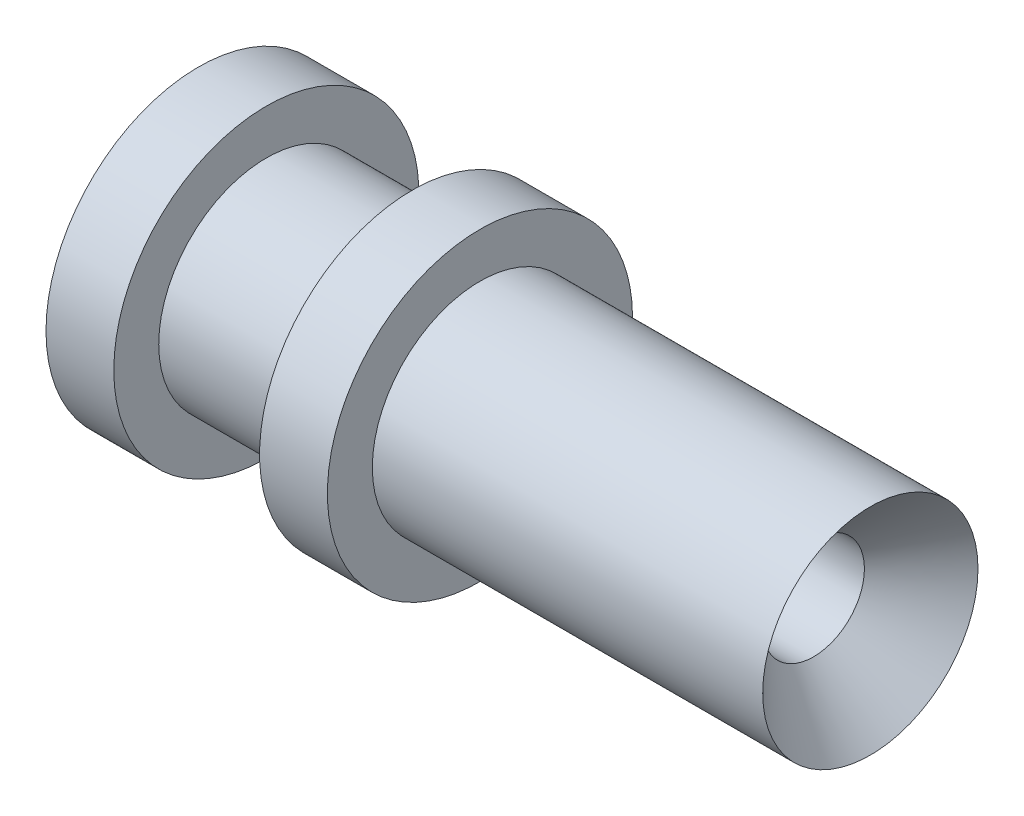
ISO-10303-21;
HEADER;
FILE_DESCRIPTION(('STEP AP214'),'2;1');
FILE_NAME('part.step','',(''),(''),'','','');
FILE_SCHEMA(('AUTOMOTIVE_DESIGN { 1 0 10303 214 1 1 1 1 }'));
ENDSEC;
DATA;
#1=APPLICATION_CONTEXT('core data for automotive mechanical design processes');
#2=APPLICATION_PROTOCOL_DEFINITION('international standard','automotive_design',2000,#1);
#3=PRODUCT_CONTEXT('',#1,'mechanical');
#4=PRODUCT('Part','Part','',(#3));
#5=PRODUCT_RELATED_PRODUCT_CATEGORY('part','',(#4));
#6=PRODUCT_DEFINITION_FORMATION('','',#4);
#7=PRODUCT_DEFINITION_CONTEXT('part definition',#1,'design');
#8=PRODUCT_DEFINITION('design','',#6,#7);
#9=PRODUCT_DEFINITION_SHAPE('','',#8);
#10=(LENGTH_UNIT() NAMED_UNIT(*) SI_UNIT(.MILLI.,.METRE.));
#11=(NAMED_UNIT(*) PLANE_ANGLE_UNIT() SI_UNIT($,.RADIAN.));
#12=(NAMED_UNIT(*) SI_UNIT($,.STERADIAN.) SOLID_ANGLE_UNIT());
#13=UNCERTAINTY_MEASURE_WITH_UNIT(LENGTH_MEASURE(1.E-05),#10,'distance_accuracy_value','');
#14=(GEOMETRIC_REPRESENTATION_CONTEXT(3) GLOBAL_UNCERTAINTY_ASSIGNED_CONTEXT((#13)) GLOBAL_UNIT_ASSIGNED_CONTEXT((#10,
#11,#12)) REPRESENTATION_CONTEXT('',''));
#15=CARTESIAN_POINT('',(0.,0.,0.));
#16=DIRECTION('',(0.,0.,1.));
#17=DIRECTION('',(1.,0.,0.));
#18=AXIS2_PLACEMENT_3D('',#15,#16,#17);
#19=CARTESIAN_POINT('',(-2.,0.,0.));
#20=DIRECTION('',(-1.,0.,0.));
#21=DIRECTION('',(0.,0.,1.));
#22=AXIS2_PLACEMENT_3D('',#19,#20,#21);
#23=PLANE('',#22);
#24=CARTESIAN_POINT('',(-2.,0.,0.));
#25=DIRECTION('',(-1.,0.,0.));
#26=DIRECTION('',(0.,0.,1.));
#27=AXIS2_PLACEMENT_3D('',#24,#25,#26);
#28=CIRCLE('',#27,4.5);
#29=CARTESIAN_POINT('',(-2.,0.,4.5));
#30=VERTEX_POINT('',#29);
#31=EDGE_CURVE('E143',#30,#30,#28,.T.);
#32=ORIENTED_EDGE('',*,*,#31,.T.);
#33=EDGE_LOOP('',(#32));
#34=FACE_BOUND('',#33,.T.);
#35=DIRECTION('',(0.,-1.,0.));
#36=VECTOR('',#35,1.);
#37=CARTESIAN_POINT('',(-2.,0.,2.8));
#38=LINE('',#37,#36);
#39=CARTESIAN_POINT('',(-2.,1.61658075373095,2.8));
#40=VERTEX_POINT('',#39);
#41=CARTESIAN_POINT('',(-2.,-1.61658075373095,2.8));
#42=VERTEX_POINT('',#41);
#43=EDGE_CURVE('E50',#40,#42,#38,.T.);
#44=ORIENTED_EDGE('',*,*,#43,.T.);
#45=DIRECTION('',(0.,-0.5,-0.866025403784439));
#46=VECTOR('',#45,1.);
#47=CARTESIAN_POINT('',(-2.,-2.42487113059643,1.4));
#48=LINE('',#47,#46);
#49=CARTESIAN_POINT('',(-2.,-3.2331615074619,0.));
#50=VERTEX_POINT('',#49);
#51=EDGE_CURVE('E11',#42,#50,#48,.T.);
#52=ORIENTED_EDGE('',*,*,#51,.T.);
#53=DIRECTION('',(0.,0.5,-0.866025403784439));
#54=VECTOR('',#53,1.);
#55=CARTESIAN_POINT('',(-2.,-2.42487113059643,-1.4));
#56=LINE('',#55,#54);
#57=CARTESIAN_POINT('',(-2.,-1.61658075373095,-2.8));
#58=VERTEX_POINT('',#57);
#59=EDGE_CURVE('E155',#50,#58,#56,.T.);
#60=ORIENTED_EDGE('',*,*,#59,.T.);
#61=DIRECTION('',(0.,1.,0.));
#62=VECTOR('',#61,1.);
#63=CARTESIAN_POINT('',(-2.,0.,-2.8));
#64=LINE('',#63,#62);
#65=CARTESIAN_POINT('',(-2.,1.61658075373095,-2.8));
#66=VERTEX_POINT('',#65);
#67=EDGE_CURVE('E162',#58,#66,#64,.T.);
#68=ORIENTED_EDGE('',*,*,#67,.T.);
#69=DIRECTION('',(0.,0.5,0.866025403784439));
#70=VECTOR('',#69,1.);
#71=CARTESIAN_POINT('',(-2.,2.42487113059643,-1.4));
#72=LINE('',#71,#70);
#73=CARTESIAN_POINT('',(-2.,3.2331615074619,0.));
#74=VERTEX_POINT('',#73);
#75=EDGE_CURVE('E165',#66,#74,#72,.T.);
#76=ORIENTED_EDGE('',*,*,#75,.T.);
#77=DIRECTION('',(0.,-0.5,0.866025403784439));
#78=VECTOR('',#77,1.);
#79=CARTESIAN_POINT('',(-2.,2.42487113059643,1.4));
#80=LINE('',#79,#78);
#81=EDGE_CURVE('E168',#74,#40,#80,.T.);
#82=ORIENTED_EDGE('',*,*,#81,.T.);
#83=EDGE_LOOP('',(#44,#52,#60,#68,#76,#82));
#84=FACE_BOUND('',#83,.T.);
#85=ADVANCED_FACE('F41',(#34,#84),#23,.T.);
#86=CARTESIAN_POINT('',(18.,0.,0.));
#87=DIRECTION('',(-1.,0.,0.));
#88=DIRECTION('',(0.,0.,1.));
#89=AXIS2_PLACEMENT_3D('',#86,#87,#88);
#90=CYLINDRICAL_SURFACE('',#89,1.5);
#91=CARTESIAN_POINT('',(-1.,0.,0.));
#92=DIRECTION('',(-1.,0.,0.));
#93=DIRECTION('',(0.,0.,1.));
#94=AXIS2_PLACEMENT_3D('',#91,#92,#93);
#95=CIRCLE('',#94,1.5);
#96=CARTESIAN_POINT('',(-1.,0.,1.5));
#97=VERTEX_POINT('',#96);
#98=EDGE_CURVE('E100',#97,#97,#95,.F.);
#99=ORIENTED_EDGE('',*,*,#98,.F.);
#100=EDGE_LOOP('',(#99));
#101=FACE_BOUND('',#100,.T.);
#102=CARTESIAN_POINT('',(16.14,0.,0.));
#103=DIRECTION('',(1.,0.,0.));
#104=DIRECTION('',(0.,0.,-1.));
#105=AXIS2_PLACEMENT_3D('',#102,#103,#104);
#106=CIRCLE('',#105,1.5);
#107=CARTESIAN_POINT('',(16.14,0.,-1.5));
#108=VERTEX_POINT('',#107);
#109=EDGE_CURVE('E118',#108,#108,#106,.T.);
#110=ORIENTED_EDGE('',*,*,#109,.T.);
#111=EDGE_LOOP('',(#110));
#112=FACE_BOUND('',#111,.T.);
#113=ADVANCED_FACE('F196',(#101,#112),#90,.F.);
#114=CARTESIAN_POINT('',(18.,0.,0.));
#115=DIRECTION('',(-1.,0.,0.));
#116=DIRECTION('',(0.,0.,1.));
#117=AXIS2_PLACEMENT_3D('',#114,#115,#116);
#118=CYLINDRICAL_SURFACE('',#117,3.175);
#119=CARTESIAN_POINT('',(0.,0.,0.));
#120=DIRECTION('',(1.,0.,0.));
#121=DIRECTION('',(0.,0.,-1.));
#122=AXIS2_PLACEMENT_3D('',#119,#120,#121);
#123=CIRCLE('',#122,3.175);
#124=CARTESIAN_POINT('',(0.,0.,-3.175));
#125=VERTEX_POINT('',#124);
#126=EDGE_CURVE('E146',#125,#125,#123,.T.);
#127=ORIENTED_EDGE('',*,*,#126,.T.);
#128=EDGE_LOOP('',(#127));
#129=FACE_BOUND('',#128,.T.);
#130=CARTESIAN_POINT('',(4.30000000000008,0.,0.));
#131=DIRECTION('',(1.,0.,0.));
#132=DIRECTION('',(0.,0.,-1.));
#133=AXIS2_PLACEMENT_3D('',#130,#131,#132);
#134=CIRCLE('',#133,3.175);
#135=CARTESIAN_POINT('',(4.30000000000008,0.,-3.175));
#136=VERTEX_POINT('',#135);
#137=EDGE_CURVE('E152',#136,#136,#134,.T.);
#138=ORIENTED_EDGE('',*,*,#137,.F.);
#139=EDGE_LOOP('',(#138));
#140=FACE_BOUND('',#139,.T.);
#141=ADVANCED_FACE('F203',(#129,#140),#118,.T.);
#142=CARTESIAN_POINT('',(-2.,0.,0.));
#143=DIRECTION('',(1.,0.,0.));
#144=DIRECTION('',(0.,0.,-1.));
#145=AXIS2_PLACEMENT_3D('',#142,#143,#144);
#146=CYLINDRICAL_SURFACE('',#145,4.5);
#147=ORIENTED_EDGE('',*,*,#31,.F.);
#148=EDGE_LOOP('',(#147));
#149=FACE_BOUND('',#148,.T.);
#150=CARTESIAN_POINT('',(0.,0.,0.));
#151=DIRECTION('',(-1.,0.,0.));
#152=DIRECTION('',(0.,0.,1.));
#153=AXIS2_PLACEMENT_3D('',#150,#151,#152);
#154=CIRCLE('',#153,4.5);
#155=CARTESIAN_POINT('',(0.,0.,4.5));
#156=VERTEX_POINT('',#155);
#157=EDGE_CURVE('E147',#156,#156,#154,.T.);
#158=ORIENTED_EDGE('',*,*,#157,.T.);
#159=EDGE_LOOP('',(#158));
#160=FACE_BOUND('',#159,.T.);
#161=ADVANCED_FACE('F212',(#149,#160),#146,.T.);
#162=CARTESIAN_POINT('',(0.,0.,0.));
#163=DIRECTION('',(-1.,0.,0.));
#164=DIRECTION('',(0.,0.,1.));
#165=AXIS2_PLACEMENT_3D('',#162,#163,#164);
#166=PLANE('',#165);
#167=ORIENTED_EDGE('',*,*,#126,.F.);
#168=EDGE_LOOP('',(#167));
#169=FACE_BOUND('',#168,.T.);
#170=ORIENTED_EDGE('',*,*,#157,.F.);
#171=EDGE_LOOP('',(#170));
#172=FACE_BOUND('',#171,.T.);
#173=ADVANCED_FACE('F210',(#169,#172),#166,.F.);
#174=CARTESIAN_POINT('',(6.30000000000008,0.,0.));
#175=DIRECTION('',(-1.,0.,0.));
#176=DIRECTION('',(0.,0.,1.));
#177=AXIS2_PLACEMENT_3D('',#174,#175,#176);
#178=CYLINDRICAL_SURFACE('',#177,4.5);
#179=CARTESIAN_POINT('',(6.30000000000008,0.,0.));
#180=DIRECTION('',(1.,0.,0.));
#181=DIRECTION('',(0.,0.,-1.));
#182=AXIS2_PLACEMENT_3D('',#179,#180,#181);
#183=CIRCLE('',#182,4.5);
#184=CARTESIAN_POINT('',(6.30000000000008,0.,-4.5));
#185=VERTEX_POINT('',#184);
#186=EDGE_CURVE('E136',#185,#185,#183,.T.);
#187=ORIENTED_EDGE('',*,*,#186,.F.);
#188=EDGE_LOOP('',(#187));
#189=FACE_BOUND('',#188,.T.);
#190=CARTESIAN_POINT('',(4.30000000000008,0.,0.));
#191=DIRECTION('',(1.,0.,0.));
#192=DIRECTION('',(0.,0.,-1.));
#193=AXIS2_PLACEMENT_3D('',#190,#191,#192);
#194=CIRCLE('',#193,4.5);
#195=CARTESIAN_POINT('',(4.30000000000008,0.,-4.5));
#196=VERTEX_POINT('',#195);
#197=EDGE_CURVE('E140',#196,#196,#194,.T.);
#198=ORIENTED_EDGE('',*,*,#197,.T.);
#199=EDGE_LOOP('',(#198));
#200=FACE_BOUND('',#199,.T.);
#201=ADVANCED_FACE('F208',(#189,#200),#178,.T.);
#202=CARTESIAN_POINT('',(6.30000000000008,0.,0.));
#203=DIRECTION('',(1.,0.,0.));
#204=DIRECTION('',(0.,0.,-1.));
#205=AXIS2_PLACEMENT_3D('',#202,#203,#204);
#206=PLANE('',#205);
#207=CARTESIAN_POINT('',(6.30000000000008,0.,0.));
#208=DIRECTION('',(1.,0.,0.));
#209=DIRECTION('',(0.,0.,-1.));
#210=AXIS2_PLACEMENT_3D('',#207,#208,#209);
#211=CIRCLE('',#210,3.175);
#212=CARTESIAN_POINT('',(6.30000000000008,0.,-3.175));
#213=VERTEX_POINT('',#212);
#214=EDGE_CURVE('E139',#213,#213,#211,.T.);
#215=ORIENTED_EDGE('',*,*,#214,.F.);
#216=EDGE_LOOP('',(#215));
#217=FACE_BOUND('',#216,.T.);
#218=ORIENTED_EDGE('',*,*,#186,.T.);
#219=EDGE_LOOP('',(#218));
#220=FACE_BOUND('',#219,.T.);
#221=ADVANCED_FACE('F233',(#217,#220),#206,.T.);
#222=CARTESIAN_POINT('',(4.30000000000008,0.,0.));
#223=DIRECTION('',(1.,0.,0.));
#224=DIRECTION('',(0.,0.,-1.));
#225=AXIS2_PLACEMENT_3D('',#222,#223,#224);
#226=PLANE('',#225);
#227=ORIENTED_EDGE('',*,*,#137,.T.);
#228=EDGE_LOOP('',(#227));
#229=FACE_BOUND('',#228,.T.);
#230=ORIENTED_EDGE('',*,*,#197,.F.);
#231=EDGE_LOOP('',(#230));
#232=FACE_BOUND('',#231,.T.);
#233=ADVANCED_FACE('F229',(#229,#232),#226,.F.);
#234=CARTESIAN_POINT('',(17.815,0.,0.));
#235=DIRECTION('',(1.,0.,0.));
#236=DIRECTION('',(0.,0.,-1.));
#237=AXIS2_PLACEMENT_3D('',#234,#235,#236);
#238=CIRCLE('',#237,3.175);
#239=CARTESIAN_POINT('',(17.815,0.,-3.175));
#240=VERTEX_POINT('',#239);
#241=EDGE_CURVE('E45',#240,#240,#238,.F.);
#242=ORIENTED_EDGE('',*,*,#241,.T.);
#243=EDGE_LOOP('',(#242));
#244=FACE_BOUND('',#243,.T.);
#245=ORIENTED_EDGE('',*,*,#214,.T.);
#246=EDGE_LOOP('',(#245));
#247=FACE_BOUND('',#246,.T.);
#248=ADVANCED_FACE('F43',(#244,#247),#118,.T.);
#249=CARTESIAN_POINT('',(-1.,0.,0.));
#250=DIRECTION('',(-1.,0.,0.));
#251=DIRECTION('',(0.,0.,1.));
#252=AXIS2_PLACEMENT_3D('',#249,#250,#251);
#253=PLANE('',#252);
#254=DIRECTION('',(0.,0.5,0.866025403784439));
#255=VECTOR('',#254,1.);
#256=CARTESIAN_POINT('',(-1.,-3.2331615074619,0.));
#257=LINE('',#256,#255);
#258=CARTESIAN_POINT('',(-1.,-3.2331615074619,0.));
#259=VERTEX_POINT('',#258);
#260=CARTESIAN_POINT('',(-1.,-1.61658075373095,2.8));
#261=VERTEX_POINT('',#260);
#262=EDGE_CURVE('E96',#259,#261,#257,.T.);
#263=ORIENTED_EDGE('',*,*,#262,.T.);
#264=DIRECTION('',(0.,1.,0.));
#265=VECTOR('',#264,1.);
#266=CARTESIAN_POINT('',(-1.,-1.61658075373095,2.8));
#267=LINE('',#266,#265);
#268=CARTESIAN_POINT('',(-1.,1.61658075373095,2.8));
#269=VERTEX_POINT('',#268);
#270=EDGE_CURVE('E104',#261,#269,#267,.T.);
#271=ORIENTED_EDGE('',*,*,#270,.T.);
#272=DIRECTION('',(0.,0.5,-0.866025403784439));
#273=VECTOR('',#272,1.);
#274=CARTESIAN_POINT('',(-1.,1.61658075373095,2.8));
#275=LINE('',#274,#273);
#276=CARTESIAN_POINT('',(-1.,3.2331615074619,0.));
#277=VERTEX_POINT('',#276);
#278=EDGE_CURVE('E110',#269,#277,#275,.T.);
#279=ORIENTED_EDGE('',*,*,#278,.T.);
#280=DIRECTION('',(0.,-0.5,-0.866025403784439));
#281=VECTOR('',#280,1.);
#282=CARTESIAN_POINT('',(-1.,3.2331615074619,0.));
#283=LINE('',#282,#281);
#284=CARTESIAN_POINT('',(-1.,1.61658075373095,-2.8));
#285=VERTEX_POINT('',#284);
#286=EDGE_CURVE('E122',#277,#285,#283,.T.);
#287=ORIENTED_EDGE('',*,*,#286,.T.);
#288=DIRECTION('',(0.,-1.,0.));
#289=VECTOR('',#288,1.);
#290=CARTESIAN_POINT('',(-1.,1.61658075373095,-2.8));
#291=LINE('',#290,#289);
#292=CARTESIAN_POINT('',(-1.,-1.61658075373095,-2.8));
#293=VERTEX_POINT('',#292);
#294=EDGE_CURVE('E125',#285,#293,#291,.T.);
#295=ORIENTED_EDGE('',*,*,#294,.T.);
#296=DIRECTION('',(0.,-0.5,0.866025403784439));
#297=VECTOR('',#296,1.);
#298=CARTESIAN_POINT('',(-1.,-1.61658075373095,-2.8));
#299=LINE('',#298,#297);
#300=EDGE_CURVE('E115',#293,#259,#299,.T.);
#301=ORIENTED_EDGE('',*,*,#300,.T.);
#302=EDGE_LOOP('',(#263,#271,#279,#287,#295,#301));
#303=FACE_BOUND('',#302,.T.);
#304=ORIENTED_EDGE('',*,*,#98,.T.);
#305=EDGE_LOOP('',(#304));
#306=FACE_BOUND('',#305,.T.);
#307=ADVANCED_FACE('F112',(#303,#306),#253,.T.);
#308=CARTESIAN_POINT('',(-2.000012,-3.2331615074619,0.));
#309=DIRECTION('',(0.,0.866025403784439,-0.5));
#310=DIRECTION('',(0.,0.5,0.866025403784439));
#311=AXIS2_PLACEMENT_3D('',#308,#309,#310);
#312=PLANE('',#311);
#313=DIRECTION('',(1.,0.,0.));
#314=VECTOR('',#313,1.);
#315=CARTESIAN_POINT('',(-2.000012,-1.61658075373095,2.8));
#316=LINE('',#315,#314);
#317=EDGE_CURVE('E92',#42,#261,#316,.T.);
#318=ORIENTED_EDGE('',*,*,#317,.T.);
#319=ORIENTED_EDGE('',*,*,#262,.F.);
#320=DIRECTION('',(1.,0.,0.));
#321=VECTOR('',#320,1.);
#322=CARTESIAN_POINT('',(-2.000012,-3.2331615074619,0.));
#323=LINE('',#322,#321);
#324=EDGE_CURVE('E128',#50,#259,#323,.T.);
#325=ORIENTED_EDGE('',*,*,#324,.F.);
#326=ORIENTED_EDGE('',*,*,#51,.F.);
#327=EDGE_LOOP('',(#318,#319,#325,#326));
#328=FACE_BOUND('',#327,.T.);
#329=ADVANCED_FACE('F94',(#328),#312,.T.);
#330=CARTESIAN_POINT('',(-2.000012,-1.61658075373095,2.8));
#331=DIRECTION('',(0.,0.,-1.));
#332=DIRECTION('',(-1.,0.,0.));
#333=AXIS2_PLACEMENT_3D('',#330,#331,#332);
#334=PLANE('',#333);
#335=DIRECTION('',(1.,0.,0.));
#336=VECTOR('',#335,1.);
#337=CARTESIAN_POINT('',(-2.000012,1.61658075373095,2.8));
#338=LINE('',#337,#336);
#339=EDGE_CURVE('E101',#40,#269,#338,.T.);
#340=ORIENTED_EDGE('',*,*,#339,.T.);
#341=ORIENTED_EDGE('',*,*,#270,.F.);
#342=ORIENTED_EDGE('',*,*,#317,.F.);
#343=ORIENTED_EDGE('',*,*,#43,.F.);
#344=EDGE_LOOP('',(#340,#341,#342,#343));
#345=FACE_BOUND('',#344,.T.);
#346=ADVANCED_FACE('F105',(#345),#334,.T.);
#347=CARTESIAN_POINT('',(-2.000012,1.61658075373095,2.8));
#348=DIRECTION('',(0.,-0.866025403784439,-0.5));
#349=DIRECTION('',(0.,0.5,-0.866025403784439));
#350=AXIS2_PLACEMENT_3D('',#347,#348,#349);
#351=PLANE('',#350);
#352=DIRECTION('',(1.,0.,0.));
#353=VECTOR('',#352,1.);
#354=CARTESIAN_POINT('',(-2.000012,3.2331615074619,0.));
#355=LINE('',#354,#353);
#356=EDGE_CURVE('E133',#74,#277,#355,.T.);
#357=ORIENTED_EDGE('',*,*,#356,.T.);
#358=ORIENTED_EDGE('',*,*,#278,.F.);
#359=ORIENTED_EDGE('',*,*,#339,.F.);
#360=ORIENTED_EDGE('',*,*,#81,.F.);
#361=EDGE_LOOP('',(#357,#358,#359,#360));
#362=FACE_BOUND('',#361,.T.);
#363=ADVANCED_FACE('F173',(#362),#351,.T.);
#364=CARTESIAN_POINT('',(-2.000012,3.2331615074619,0.));
#365=DIRECTION('',(0.,-0.866025403784439,0.5));
#366=DIRECTION('',(0.,-0.5,-0.866025403784439));
#367=AXIS2_PLACEMENT_3D('',#364,#365,#366);
#368=PLANE('',#367);
#369=DIRECTION('',(1.,0.,0.));
#370=VECTOR('',#369,1.);
#371=CARTESIAN_POINT('',(-2.000012,1.61658075373095,-2.8));
#372=LINE('',#371,#370);
#373=EDGE_CURVE('E131',#66,#285,#372,.T.);
#374=ORIENTED_EDGE('',*,*,#373,.T.);
#375=ORIENTED_EDGE('',*,*,#286,.F.);
#376=ORIENTED_EDGE('',*,*,#356,.F.);
#377=ORIENTED_EDGE('',*,*,#75,.F.);
#378=EDGE_LOOP('',(#374,#375,#376,#377));
#379=FACE_BOUND('',#378,.T.);
#380=ADVANCED_FACE('F178',(#379),#368,.T.);
#381=CARTESIAN_POINT('',(-2.000012,1.61658075373095,-2.8));
#382=DIRECTION('',(0.,0.,1.));
#383=DIRECTION('',(1.,0.,0.));
#384=AXIS2_PLACEMENT_3D('',#381,#382,#383);
#385=PLANE('',#384);
#386=DIRECTION('',(1.,0.,0.));
#387=VECTOR('',#386,1.);
#388=CARTESIAN_POINT('',(-2.000012,-1.61658075373095,-2.8));
#389=LINE('',#388,#387);
#390=EDGE_CURVE('E57',#58,#293,#389,.T.);
#391=ORIENTED_EDGE('',*,*,#390,.T.);
#392=ORIENTED_EDGE('',*,*,#294,.F.);
#393=ORIENTED_EDGE('',*,*,#373,.F.);
#394=ORIENTED_EDGE('',*,*,#67,.F.);
#395=EDGE_LOOP('',(#391,#392,#393,#394));
#396=FACE_BOUND('',#395,.T.);
#397=ADVANCED_FACE('F181',(#396),#385,.T.);
#398=CARTESIAN_POINT('',(-2.000012,-1.61658075373095,-2.8));
#399=DIRECTION('',(0.,0.866025403784439,0.5));
#400=DIRECTION('',(0.,-0.5,0.866025403784439));
#401=AXIS2_PLACEMENT_3D('',#398,#399,#400);
#402=PLANE('',#401);
#403=ORIENTED_EDGE('',*,*,#324,.T.);
#404=ORIENTED_EDGE('',*,*,#300,.F.);
#405=ORIENTED_EDGE('',*,*,#390,.F.);
#406=ORIENTED_EDGE('',*,*,#59,.F.);
#407=EDGE_LOOP('',(#403,#404,#405,#406));
#408=FACE_BOUND('',#407,.T.);
#409=ADVANCED_FACE('F182',(#408),#402,.T.);
#410=CARTESIAN_POINT('',(18.,0.,0.));
#411=DIRECTION('',(1.,0.,0.));
#412=DIRECTION('',(0.,0.,-1.));
#413=AXIS2_PLACEMENT_3D('',#410,#411,#412);
#414=CONICAL_SURFACE('',#413,3.36,0.785398163397447);
#415=ORIENTED_EDGE('',*,*,#109,.F.);
#416=EDGE_LOOP('',(#415));
#417=FACE_BOUND('',#416,.T.);
#418=ORIENTED_EDGE('',*,*,#241,.F.);
#419=EDGE_LOOP('',(#418));
#420=FACE_BOUND('',#419,.T.);
#421=ADVANCED_FACE('F184',(#417,#420),#414,.F.);
#422=CLOSED_SHELL('',(#85,#113,#141,#161,#173,#201,#221,#233,#248,#307,#329,#346,#363,#380,#397,
#409,#421));
#423=MANIFOLD_SOLID_BREP('B2',#422);
#424=ADVANCED_BREP_SHAPE_REPRESENTATION('',(#18,#423),#14);
#425=SHAPE_DEFINITION_REPRESENTATION(#9,#424);
ENDSEC;
END-ISO-10303-21;
